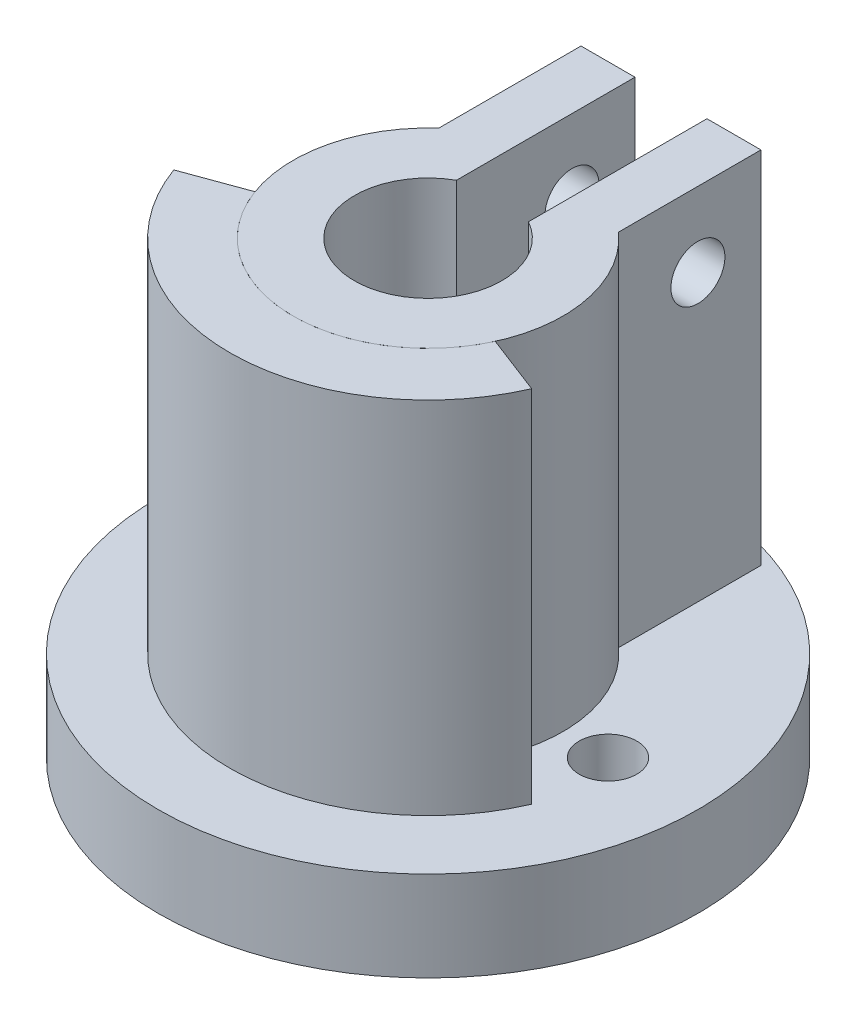
ISO-10303-21;
HEADER;
FILE_DESCRIPTION(('STEP AP214'),'2;1');
FILE_NAME('part.step','',(''),(''),'','','');
FILE_SCHEMA(('AUTOMOTIVE_DESIGN { 1 0 10303 214 1 1 1 1 }'));
ENDSEC;
DATA;
#1=APPLICATION_CONTEXT('core data for automotive mechanical design processes');
#2=APPLICATION_PROTOCOL_DEFINITION('international standard','automotive_design',2000,#1);
#3=PRODUCT_CONTEXT('',#1,'mechanical');
#4=PRODUCT('Part','Part','',(#3));
#5=PRODUCT_RELATED_PRODUCT_CATEGORY('part','',(#4));
#6=PRODUCT_DEFINITION_FORMATION('','',#4);
#7=PRODUCT_DEFINITION_CONTEXT('part definition',#1,'design');
#8=PRODUCT_DEFINITION('design','',#6,#7);
#9=PRODUCT_DEFINITION_SHAPE('','',#8);
#10=(LENGTH_UNIT() NAMED_UNIT(*) SI_UNIT(.MILLI.,.METRE.));
#11=(NAMED_UNIT(*) PLANE_ANGLE_UNIT() SI_UNIT($,.RADIAN.));
#12=(NAMED_UNIT(*) SI_UNIT($,.STERADIAN.) SOLID_ANGLE_UNIT());
#13=UNCERTAINTY_MEASURE_WITH_UNIT(LENGTH_MEASURE(1.E-05),#10,'distance_accuracy_value','');
#14=(GEOMETRIC_REPRESENTATION_CONTEXT(3) GLOBAL_UNCERTAINTY_ASSIGNED_CONTEXT((#13)) GLOBAL_UNIT_ASSIGNED_CONTEXT((#10,
#11,#12)) REPRESENTATION_CONTEXT('',''));
#15=CARTESIAN_POINT('',(0.,0.,0.));
#16=DIRECTION('',(0.,0.,1.));
#17=DIRECTION('',(1.,0.,0.));
#18=AXIS2_PLACEMENT_3D('',#15,#16,#17);
#19=CARTESIAN_POINT('',(0.,5.,0.));
#20=DIRECTION('',(-0.342845492340402,0.,-0.939391807704255));
#21=DIRECTION('',(-0.939391807704255,0.,0.342845492340402));
#22=AXIS2_PLACEMENT_3D('',#19,#20,#21);
#23=PLANE('',#22);
#24=DIRECTION('',(-0.939391807704255,0.,0.342845492340402));
#25=VECTOR('',#24,1.);
#26=CARTESIAN_POINT('',(0.,25.,0.));
#27=LINE('',#26,#25);
#28=CARTESIAN_POINT('',(-7.04543855778191,25.,2.57134119255302));
#29=VERTEX_POINT('',#28);
#30=CARTESIAN_POINT('',(-10.3531128788662,25.,3.77852782310841));
#31=VERTEX_POINT('',#30);
#32=EDGE_CURVE('E114',#29,#31,#27,.T.);
#33=ORIENTED_EDGE('',*,*,#32,.F.);
#34=DIRECTION('',(0.,1.,0.));
#35=VECTOR('',#34,1.);
#36=CARTESIAN_POINT('',(-7.04543855778191,5.,2.57134119255302));
#37=LINE('',#36,#35);
#38=CARTESIAN_POINT('',(-7.04543855778191,5.,2.57134119255302));
#39=VERTEX_POINT('',#38);
#40=EDGE_CURVE('E13',#39,#29,#37,.T.);
#41=ORIENTED_EDGE('',*,*,#40,.F.);
#42=DIRECTION('',(-0.939391807704255,0.,0.342845492340402));
#43=VECTOR('',#42,1.);
#44=CARTESIAN_POINT('',(0.,5.,0.));
#45=LINE('',#44,#43);
#46=CARTESIAN_POINT('',(-10.3531128788662,5.,3.77852782310841));
#47=VERTEX_POINT('',#46);
#48=EDGE_CURVE('E109',#39,#47,#45,.T.);
#49=ORIENTED_EDGE('',*,*,#48,.T.);
#50=DIRECTION('',(0.,1.,0.));
#51=VECTOR('',#50,1.);
#52=CARTESIAN_POINT('',(-10.3531128788662,5.,3.77852782310841));
#53=LINE('',#52,#51);
#54=EDGE_CURVE('E52',#47,#31,#53,.T.);
#55=ORIENTED_EDGE('',*,*,#54,.T.);
#56=EDGE_LOOP('',(#33,#41,#49,#55));
#57=FACE_BOUND('',#56,.T.);
#58=ADVANCED_FACE('F49',(#57),#23,.T.);
#59=CARTESIAN_POINT('',(0.,5.,0.));
#60=DIRECTION('',(0.,1.,0.));
#61=DIRECTION('',(0.,0.,1.));
#62=AXIS2_PLACEMENT_3D('',#59,#60,#61);
#63=CYLINDRICAL_SURFACE('',#62,7.5);
#64=CARTESIAN_POINT('',(0.,25.,0.));
#65=DIRECTION('',(0.,1.,0.));
#66=DIRECTION('',(0.,0.,1.));
#67=AXIS2_PLACEMENT_3D('',#64,#65,#66);
#68=CIRCLE('',#67,7.5);
#69=CARTESIAN_POINT('',(6.83078698314933,25.,3.09682889272844));
#70=VERTEX_POINT('',#69);
#71=EDGE_CURVE('E82',#29,#70,#68,.T.);
#72=ORIENTED_EDGE('',*,*,#71,.T.);
#73=DIRECTION('',(0.,1.,0.));
#74=VECTOR('',#73,1.);
#75=CARTESIAN_POINT('',(6.83078698314933,5.,3.09682889272844));
#76=LINE('',#75,#74);
#77=CARTESIAN_POINT('',(6.83078698314933,5.,3.09682889272844));
#78=VERTEX_POINT('',#77);
#79=EDGE_CURVE('E58',#78,#70,#76,.T.);
#80=ORIENTED_EDGE('',*,*,#79,.F.);
#81=CARTESIAN_POINT('',(0.,5.,0.));
#82=DIRECTION('',(0.,1.,0.));
#83=DIRECTION('',(0.,0.,1.));
#84=AXIS2_PLACEMENT_3D('',#81,#82,#83);
#85=CIRCLE('',#84,7.5);
#86=EDGE_CURVE('E99',#39,#78,#85,.T.);
#87=ORIENTED_EDGE('',*,*,#86,.F.);
#88=ORIENTED_EDGE('',*,*,#40,.T.);
#89=EDGE_LOOP('',(#72,#80,#87,#88));
#90=FACE_BOUND('',#89,.T.);
#91=ADVANCED_FACE('F124',(#90),#63,.F.);
#92=CARTESIAN_POINT('',(-0.15638143559644,5.,0.406081802327536));
#93=DIRECTION('',(-0.359371675329784,0.,0.933194512934289));
#94=DIRECTION('',(0.933194512934289,0.,0.359371675329784));
#95=AXIS2_PLACEMENT_3D('',#92,#93,#94);
#96=PLANE('',#95);
#97=DIRECTION('',(0.933194512934289,0.,0.359371675329784));
#98=VECTOR('',#97,1.);
#99=CARTESIAN_POINT('',(-0.15638143559644,25.,0.406081802327536));
#100=LINE('',#99,#98);
#101=CARTESIAN_POINT('',(10.1204106372597,25.,4.36365756284664));
#102=VERTEX_POINT('',#101);
#103=EDGE_CURVE('E106',#70,#102,#100,.T.);
#104=ORIENTED_EDGE('',*,*,#103,.T.);
#105=DIRECTION('',(0.,1.,0.));
#106=VECTOR('',#105,1.);
#107=CARTESIAN_POINT('',(10.1204106372597,5.,4.36365756284664));
#108=LINE('',#107,#106);
#109=CARTESIAN_POINT('',(10.1204106372597,5.,4.36365756284664));
#110=VERTEX_POINT('',#109);
#111=EDGE_CURVE('E103',#110,#102,#108,.T.);
#112=ORIENTED_EDGE('',*,*,#111,.F.);
#113=DIRECTION('',(0.933194512934289,0.,0.359371675329784));
#114=VECTOR('',#113,1.);
#115=CARTESIAN_POINT('',(-0.15638143559644,5.,0.406081802327536));
#116=LINE('',#115,#114);
#117=EDGE_CURVE('E94',#78,#110,#116,.T.);
#118=ORIENTED_EDGE('',*,*,#117,.F.);
#119=ORIENTED_EDGE('',*,*,#79,.T.);
#120=EDGE_LOOP('',(#104,#112,#118,#119));
#121=FACE_BOUND('',#120,.T.);
#122=ADVANCED_FACE('F104',(#121),#96,.F.);
#123=CARTESIAN_POINT('',(0.,5.,0.));
#124=DIRECTION('',(0.,1.,0.));
#125=DIRECTION('',(0.,0.,1.));
#126=AXIS2_PLACEMENT_3D('',#123,#124,#125);
#127=CYLINDRICAL_SURFACE('',#126,11.0210806544798);
#128=CARTESIAN_POINT('',(0.,25.,0.));
#129=DIRECTION('',(0.,1.,0.));
#130=DIRECTION('',(0.,0.,1.));
#131=AXIS2_PLACEMENT_3D('',#128,#129,#130);
#132=CIRCLE('',#131,11.0210806544798);
#133=EDGE_CURVE('E117',#31,#102,#132,.T.);
#134=ORIENTED_EDGE('',*,*,#133,.F.);
#135=ORIENTED_EDGE('',*,*,#54,.F.);
#136=CARTESIAN_POINT('',(0.,5.,0.));
#137=DIRECTION('',(0.,1.,0.));
#138=DIRECTION('',(0.,0.,1.));
#139=AXIS2_PLACEMENT_3D('',#136,#137,#138);
#140=CIRCLE('',#139,11.0210806544798);
#141=EDGE_CURVE('E98',#47,#110,#140,.T.);
#142=ORIENTED_EDGE('',*,*,#141,.T.);
#143=ORIENTED_EDGE('',*,*,#111,.T.);
#144=EDGE_LOOP('',(#134,#135,#142,#143));
#145=FACE_BOUND('',#144,.T.);
#146=ADVANCED_FACE('F108',(#145),#127,.T.);
#147=CARTESIAN_POINT('',(0.,5.,0.));
#148=DIRECTION('',(0.,1.,0.));
#149=DIRECTION('',(0.,0.,1.));
#150=AXIS2_PLACEMENT_3D('',#147,#148,#149);
#151=PLANE('',#150);
#152=ORIENTED_EDGE('',*,*,#48,.F.);
#153=ORIENTED_EDGE('',*,*,#86,.T.);
#154=ORIENTED_EDGE('',*,*,#117,.T.);
#155=ORIENTED_EDGE('',*,*,#141,.F.);
#156=EDGE_LOOP('',(#152,#153,#154,#155));
#157=FACE_BOUND('',#156,.T.);
#158=ADVANCED_FACE('F97',(#157),#151,.F.);
#159=CARTESIAN_POINT('',(0.,25.,0.));
#160=DIRECTION('',(0.,1.,0.));
#161=DIRECTION('',(0.,0.,1.));
#162=AXIS2_PLACEMENT_3D('',#159,#160,#161);
#163=PLANE('',#162);
#164=ORIENTED_EDGE('',*,*,#32,.T.);
#165=ORIENTED_EDGE('',*,*,#133,.T.);
#166=ORIENTED_EDGE('',*,*,#103,.F.);
#167=ORIENTED_EDGE('',*,*,#71,.F.);
#168=EDGE_LOOP('',(#164,#165,#166,#167));
#169=FACE_BOUND('',#168,.T.);
#170=ADVANCED_FACE('F122',(#169),#163,.T.);
#171=CLOSED_SHELL('',(#58,#91,#122,#146,#158,#170));
#172=MANIFOLD_SOLID_BREP('B2',#171);
#173=CARTESIAN_POINT('',(0.,5.,0.));
#174=DIRECTION('',(0.,1.,0.));
#175=DIRECTION('',(0.,0.,1.));
#176=AXIS2_PLACEMENT_3D('',#173,#174,#175);
#177=PLANE('',#176);
#178=CARTESIAN_POINT('',(0.,5.,0.));
#179=DIRECTION('',(0.,1.,0.));
#180=DIRECTION('',(0.,0.,1.));
#181=AXIS2_PLACEMENT_3D('',#178,#179,#180);
#182=CIRCLE('',#181,15.);
#183=CARTESIAN_POINT('',(0.,5.,15.));
#184=VERTEX_POINT('',#183);
#185=EDGE_CURVE('E332',#184,#184,#182,.T.);
#186=ORIENTED_EDGE('',*,*,#185,.T.);
#187=EDGE_LOOP('',(#186));
#188=FACE_BOUND('',#187,.T.);
#189=CARTESIAN_POINT('',(10.,5.,0.));
#190=DIRECTION('',(0.,1.,0.));
#191=DIRECTION('',(0.,0.,1.));
#192=AXIS2_PLACEMENT_3D('',#189,#190,#191);
#193=CIRCLE('',#192,1.6);
#194=CARTESIAN_POINT('',(10.,5.,1.6));
#195=VERTEX_POINT('',#194);
#196=EDGE_CURVE('E347',#195,#195,#193,.T.);
#197=ORIENTED_EDGE('',*,*,#196,.F.);
#198=EDGE_LOOP('',(#197));
#199=FACE_BOUND('',#198,.T.);
#200=CARTESIAN_POINT('',(-10.,5.,0.));
#201=DIRECTION('',(0.,1.,0.));
#202=DIRECTION('',(0.,0.,1.));
#203=AXIS2_PLACEMENT_3D('',#200,#201,#202);
#204=CIRCLE('',#203,1.6);
#205=CARTESIAN_POINT('',(-10.,5.,1.6));
#206=VERTEX_POINT('',#205);
#207=EDGE_CURVE('E344',#206,#206,#204,.T.);
#208=ORIENTED_EDGE('',*,*,#207,.F.);
#209=EDGE_LOOP('',(#208));
#210=FACE_BOUND('',#209,.T.);
#211=CARTESIAN_POINT('',(0.,5.,0.));
#212=DIRECTION('',(0.,1.,0.));
#213=DIRECTION('',(0.,0.,1.));
#214=AXIS2_PLACEMENT_3D('',#211,#212,#213);
#215=CIRCLE('',#214,7.5);
#216=CARTESIAN_POINT('',(-5.,5.,-5.59016994374947));
#217=VERTEX_POINT('',#216);
#218=CARTESIAN_POINT('',(5.,5.,-5.59016994374948));
#219=VERTEX_POINT('',#218);
#220=EDGE_CURVE('E339',#217,#219,#215,.T.);
#221=ORIENTED_EDGE('',*,*,#220,.F.);
#222=DIRECTION('',(0.,0.,-1.));
#223=VECTOR('',#222,1.);
#224=CARTESIAN_POINT('',(-5.,5.,0.));
#225=LINE('',#224,#223);
#226=CARTESIAN_POINT('',(-5.,5.,-13.5));
#227=VERTEX_POINT('',#226);
#228=EDGE_CURVE('E268',#217,#227,#225,.T.);
#229=ORIENTED_EDGE('',*,*,#228,.T.);
#230=DIRECTION('',(-1.,0.,0.));
#231=VECTOR('',#230,1.);
#232=CARTESIAN_POINT('',(0.,5.,-13.5));
#233=LINE('',#232,#231);
#234=CARTESIAN_POINT('',(-2.,5.,-13.5));
#235=VERTEX_POINT('',#234);
#236=EDGE_CURVE('E47',#235,#227,#233,.T.);
#237=ORIENTED_EDGE('',*,*,#236,.F.);
#238=DIRECTION('',(0.,0.,1.));
#239=VECTOR('',#238,1.);
#240=CARTESIAN_POINT('',(-2.,5.00000000000001,-20.));
#241=LINE('',#240,#239);
#242=CARTESIAN_POINT('',(-2.,5.00000000000001,-3.57910603363465));
#243=VERTEX_POINT('',#242);
#244=EDGE_CURVE('E265',#235,#243,#241,.T.);
#245=ORIENTED_EDGE('',*,*,#244,.T.);
#246=CARTESIAN_POINT('',(0.,5.,0.));
#247=DIRECTION('',(0.,1.,0.));
#248=DIRECTION('',(0.,0.,1.));
#249=AXIS2_PLACEMENT_3D('',#246,#247,#248);
#250=CIRCLE('',#249,4.1);
#251=CARTESIAN_POINT('',(2.,5.,-3.57910603363466));
#252=VERTEX_POINT('',#251);
#253=EDGE_CURVE('E323',#252,#243,#250,.T.);
#254=ORIENTED_EDGE('',*,*,#253,.F.);
#255=DIRECTION('',(0.,0.,1.));
#256=VECTOR('',#255,1.);
#257=CARTESIAN_POINT('',(2.,5.,-20.));
#258=LINE('',#257,#256);
#259=CARTESIAN_POINT('',(2.,5.,-13.5));
#260=VERTEX_POINT('',#259);
#261=EDGE_CURVE('E192',#260,#252,#258,.T.);
#262=ORIENTED_EDGE('',*,*,#261,.F.);
#263=DIRECTION('',(-1.,0.,0.));
#264=VECTOR('',#263,1.);
#265=CARTESIAN_POINT('',(0.,5.,-13.5));
#266=LINE('',#265,#264);
#267=CARTESIAN_POINT('',(5.,5.,-13.5));
#268=VERTEX_POINT('',#267);
#269=EDGE_CURVE('E196',#268,#260,#266,.T.);
#270=ORIENTED_EDGE('',*,*,#269,.F.);
#271=DIRECTION('',(0.,0.,-1.));
#272=VECTOR('',#271,1.);
#273=CARTESIAN_POINT('',(5.,5.,0.));
#274=LINE('',#273,#272);
#275=EDGE_CURVE('E300',#219,#268,#274,.T.);
#276=ORIENTED_EDGE('',*,*,#275,.F.);
#277=EDGE_LOOP('',(#221,#229,#237,#245,#254,#262,#270,#276));
#278=FACE_BOUND('',#277,.T.);
#279=ADVANCED_FACE('F176',(#188,#199,#210,#278),#177,.T.);
#280=CARTESIAN_POINT('',(0.,25.,0.));
#281=DIRECTION('',(0.,-1.,0.));
#282=DIRECTION('',(0.,0.,-1.));
#283=AXIS2_PLACEMENT_3D('',#280,#281,#282);
#284=CYLINDRICAL_SURFACE('',#283,7.5);
#285=DIRECTION('',(0.,-1.,0.));
#286=VECTOR('',#285,1.);
#287=CARTESIAN_POINT('',(-5.,25.,-5.59016994374947));
#288=LINE('',#287,#286);
#289=CARTESIAN_POINT('',(-5.,25.,-5.59016994374947));
#290=VERTEX_POINT('',#289);
#291=EDGE_CURVE('E185',#217,#290,#288,.F.);
#292=ORIENTED_EDGE('',*,*,#291,.F.);
#293=ORIENTED_EDGE('',*,*,#220,.T.);
#294=DIRECTION('',(0.,-1.,0.));
#295=VECTOR('',#294,1.);
#296=CARTESIAN_POINT('',(5.,25.,-5.59016994374948));
#297=LINE('',#296,#295);
#298=CARTESIAN_POINT('',(5.,25.,-5.59016994374948));
#299=VERTEX_POINT('',#298);
#300=EDGE_CURVE('E313',#219,#299,#297,.F.);
#301=ORIENTED_EDGE('',*,*,#300,.T.);
#302=CARTESIAN_POINT('',(0.,25.,0.));
#303=DIRECTION('',(0.,1.,0.));
#304=DIRECTION('',(0.,0.,1.));
#305=AXIS2_PLACEMENT_3D('',#302,#303,#304);
#306=CIRCLE('',#305,7.5);
#307=EDGE_CURVE('E336',#290,#299,#306,.T.);
#308=ORIENTED_EDGE('',*,*,#307,.F.);
#309=EDGE_LOOP('',(#292,#293,#301,#308));
#310=FACE_BOUND('',#309,.T.);
#311=ADVANCED_FACE('F375',(#310),#284,.T.);
#312=CARTESIAN_POINT('',(0.,5.,0.));
#313=DIRECTION('',(0.,-1.,0.));
#314=DIRECTION('',(0.,0.,-1.));
#315=AXIS2_PLACEMENT_3D('',#312,#313,#314);
#316=CYLINDRICAL_SURFACE('',#315,15.);
#317=ORIENTED_EDGE('',*,*,#185,.F.);
#318=EDGE_LOOP('',(#317));
#319=FACE_BOUND('',#318,.T.);
#320=CARTESIAN_POINT('',(0.,0.,0.));
#321=DIRECTION('',(0.,1.,0.));
#322=DIRECTION('',(0.,0.,1.));
#323=AXIS2_PLACEMENT_3D('',#320,#321,#322);
#324=CIRCLE('',#323,15.);
#325=CARTESIAN_POINT('',(0.,0.,15.));
#326=VERTEX_POINT('',#325);
#327=EDGE_CURVE('E333',#326,#326,#324,.T.);
#328=ORIENTED_EDGE('',*,*,#327,.T.);
#329=EDGE_LOOP('',(#328));
#330=FACE_BOUND('',#329,.T.);
#331=ADVANCED_FACE('F178',(#319,#330),#316,.T.);
#332=CARTESIAN_POINT('',(0.,0.,0.));
#333=DIRECTION('',(0.,1.,0.));
#334=DIRECTION('',(0.,0.,1.));
#335=AXIS2_PLACEMENT_3D('',#332,#333,#334);
#336=PLANE('',#335);
#337=CARTESIAN_POINT('',(0.,0.,0.));
#338=DIRECTION('',(0.,1.,0.));
#339=DIRECTION('',(0.,0.,1.));
#340=AXIS2_PLACEMENT_3D('',#337,#338,#339);
#341=CIRCLE('',#340,4.1);
#342=CARTESIAN_POINT('',(0.,0.,4.1));
#343=VERTEX_POINT('',#342);
#344=EDGE_CURVE('E326',#343,#343,#341,.T.);
#345=ORIENTED_EDGE('',*,*,#344,.T.);
#346=EDGE_LOOP('',(#345));
#347=FACE_BOUND('',#346,.T.);
#348=CARTESIAN_POINT('',(10.,0.,0.));
#349=DIRECTION('',(0.,1.,0.));
#350=DIRECTION('',(0.,0.,1.));
#351=AXIS2_PLACEMENT_3D('',#348,#349,#350);
#352=CIRCLE('',#351,1.6);
#353=CARTESIAN_POINT('',(10.,0.,1.6));
#354=VERTEX_POINT('',#353);
#355=EDGE_CURVE('E350',#354,#354,#352,.T.);
#356=ORIENTED_EDGE('',*,*,#355,.T.);
#357=EDGE_LOOP('',(#356));
#358=FACE_BOUND('',#357,.T.);
#359=CARTESIAN_POINT('',(-10.,0.,0.));
#360=DIRECTION('',(0.,1.,0.));
#361=DIRECTION('',(0.,0.,1.));
#362=AXIS2_PLACEMENT_3D('',#359,#360,#361);
#363=CIRCLE('',#362,1.6);
#364=CARTESIAN_POINT('',(-10.,0.,1.6));
#365=VERTEX_POINT('',#364);
#366=EDGE_CURVE('E343',#365,#365,#363,.T.);
#367=ORIENTED_EDGE('',*,*,#366,.T.);
#368=EDGE_LOOP('',(#367));
#369=FACE_BOUND('',#368,.T.);
#370=ORIENTED_EDGE('',*,*,#327,.F.);
#371=EDGE_LOOP('',(#370));
#372=FACE_BOUND('',#371,.T.);
#373=ADVANCED_FACE('F357',(#347,#358,#369,#372),#336,.F.);
#374=CARTESIAN_POINT('',(0.,25.,0.));
#375=DIRECTION('',(0.,1.,0.));
#376=DIRECTION('',(0.,0.,1.));
#377=AXIS2_PLACEMENT_3D('',#374,#375,#376);
#378=PLANE('',#377);
#379=DIRECTION('',(0.,0.,-1.));
#380=VECTOR('',#379,1.);
#381=CARTESIAN_POINT('',(-2.,25.,0.));
#382=LINE('',#381,#380);
#383=CARTESIAN_POINT('',(-2.,25.,-3.57910603363465));
#384=VERTEX_POINT('',#383);
#385=CARTESIAN_POINT('',(-2.,25.,-13.5));
#386=VERTEX_POINT('',#385);
#387=EDGE_CURVE('E240',#384,#386,#382,.T.);
#388=ORIENTED_EDGE('',*,*,#387,.T.);
#389=DIRECTION('',(1.,0.,0.));
#390=VECTOR('',#389,1.);
#391=CARTESIAN_POINT('',(-2.,25.,-13.5));
#392=LINE('',#391,#390);
#393=CARTESIAN_POINT('',(-5.,25.,-13.5));
#394=VERTEX_POINT('',#393);
#395=EDGE_CURVE('E244',#394,#386,#392,.T.);
#396=ORIENTED_EDGE('',*,*,#395,.F.);
#397=DIRECTION('',(0.,0.,1.));
#398=VECTOR('',#397,1.);
#399=CARTESIAN_POINT('',(-5.,25.,-8.5));
#400=LINE('',#399,#398);
#401=EDGE_CURVE('E266',#394,#290,#400,.T.);
#402=ORIENTED_EDGE('',*,*,#401,.T.);
#403=ORIENTED_EDGE('',*,*,#307,.T.);
#404=DIRECTION('',(0.,0.,1.));
#405=VECTOR('',#404,1.);
#406=CARTESIAN_POINT('',(5.,25.,-8.5));
#407=LINE('',#406,#405);
#408=CARTESIAN_POINT('',(5.,25.,-13.5));
#409=VERTEX_POINT('',#408);
#410=EDGE_CURVE('E291',#409,#299,#407,.T.);
#411=ORIENTED_EDGE('',*,*,#410,.F.);
#412=DIRECTION('',(-1.,0.,0.));
#413=VECTOR('',#412,1.);
#414=CARTESIAN_POINT('',(2.,25.,-13.5));
#415=LINE('',#414,#413);
#416=CARTESIAN_POINT('',(2.,25.,-13.5));
#417=VERTEX_POINT('',#416);
#418=EDGE_CURVE('E282',#409,#417,#415,.T.);
#419=ORIENTED_EDGE('',*,*,#418,.T.);
#420=DIRECTION('',(0.,0.,-1.));
#421=VECTOR('',#420,1.);
#422=CARTESIAN_POINT('',(2.,25.,0.));
#423=LINE('',#422,#421);
#424=CARTESIAN_POINT('',(2.,25.,-3.57910603363466));
#425=VERTEX_POINT('',#424);
#426=EDGE_CURVE('E252',#425,#417,#423,.T.);
#427=ORIENTED_EDGE('',*,*,#426,.F.);
#428=CARTESIAN_POINT('',(0.,25.,0.));
#429=DIRECTION('',(0.,1.,0.));
#430=DIRECTION('',(0.,0.,1.));
#431=AXIS2_PLACEMENT_3D('',#428,#429,#430);
#432=CIRCLE('',#431,4.1);
#433=EDGE_CURVE('E247',#384,#425,#432,.T.);
#434=ORIENTED_EDGE('',*,*,#433,.F.);
#435=EDGE_LOOP('',(#388,#396,#402,#403,#411,#419,#427,#434));
#436=FACE_BOUND('',#435,.T.);
#437=ADVANCED_FACE('F242',(#436),#378,.T.);
#438=CARTESIAN_POINT('',(0.,25.,0.));
#439=DIRECTION('',(0.,-1.,0.));
#440=DIRECTION('',(0.,0.,-1.));
#441=AXIS2_PLACEMENT_3D('',#438,#439,#440);
#442=CYLINDRICAL_SURFACE('',#441,4.1);
#443=DIRECTION('',(0.,-1.,0.));
#444=VECTOR('',#443,1.);
#445=CARTESIAN_POINT('',(2.,25.,-3.57910603363466));
#446=LINE('',#445,#444);
#447=EDGE_CURVE('E318',#252,#425,#446,.F.);
#448=ORIENTED_EDGE('',*,*,#447,.F.);
#449=ORIENTED_EDGE('',*,*,#253,.T.);
#450=DIRECTION('',(0.,-1.,0.));
#451=VECTOR('',#450,1.);
#452=CARTESIAN_POINT('',(-2.,25.,-3.57910603363465));
#453=LINE('',#452,#451);
#454=EDGE_CURVE('E330',#243,#384,#453,.F.);
#455=ORIENTED_EDGE('',*,*,#454,.T.);
#456=ORIENTED_EDGE('',*,*,#433,.T.);
#457=EDGE_LOOP('',(#448,#449,#455,#456));
#458=FACE_BOUND('',#457,.T.);
#459=ORIENTED_EDGE('',*,*,#344,.F.);
#460=EDGE_LOOP('',(#459));
#461=FACE_BOUND('',#460,.T.);
#462=ADVANCED_FACE('F360',(#458,#461),#442,.F.);
#463=CARTESIAN_POINT('',(-10.,0.,0.));
#464=DIRECTION('',(0.,1.,0.));
#465=DIRECTION('',(0.,0.,1.));
#466=AXIS2_PLACEMENT_3D('',#463,#464,#465);
#467=CYLINDRICAL_SURFACE('',#466,1.6);
#468=ORIENTED_EDGE('',*,*,#366,.F.);
#469=EDGE_LOOP('',(#468));
#470=FACE_BOUND('',#469,.T.);
#471=ORIENTED_EDGE('',*,*,#207,.T.);
#472=EDGE_LOOP('',(#471));
#473=FACE_BOUND('',#472,.T.);
#474=ADVANCED_FACE('F362',(#470,#473),#467,.F.);
#475=CARTESIAN_POINT('',(10.,0.,0.));
#476=DIRECTION('',(0.,1.,0.));
#477=DIRECTION('',(0.,0.,1.));
#478=AXIS2_PLACEMENT_3D('',#475,#476,#477);
#479=CYLINDRICAL_SURFACE('',#478,1.6);
#480=ORIENTED_EDGE('',*,*,#355,.F.);
#481=EDGE_LOOP('',(#480));
#482=FACE_BOUND('',#481,.T.);
#483=ORIENTED_EDGE('',*,*,#196,.T.);
#484=EDGE_LOOP('',(#483));
#485=FACE_BOUND('',#484,.T.);
#486=ADVANCED_FACE('F369',(#482,#485),#479,.F.);
#487=CARTESIAN_POINT('',(2.,0.,-20.));
#488=DIRECTION('',(1.,0.,0.));
#489=DIRECTION('',(0.,1.,0.));
#490=AXIS2_PLACEMENT_3D('',#487,#488,#489);
#491=PLANE('',#490);
#492=CARTESIAN_POINT('',(2.,20.8523885326031,-9.99671661476498));
#493=DIRECTION('',(1.,0.,0.));
#494=DIRECTION('',(0.,1.,0.));
#495=AXIS2_PLACEMENT_3D('',#492,#493,#494);
#496=CIRCLE('',#495,1.5);
#497=CARTESIAN_POINT('',(2.,22.3523885326031,-9.99671661476498));
#498=VERTEX_POINT('',#497);
#499=EDGE_CURVE('E262',#498,#498,#496,.T.);
#500=ORIENTED_EDGE('',*,*,#499,.T.);
#501=EDGE_LOOP('',(#500));
#502=FACE_BOUND('',#501,.T.);
#503=ORIENTED_EDGE('',*,*,#261,.T.);
#504=ORIENTED_EDGE('',*,*,#447,.T.);
#505=ORIENTED_EDGE('',*,*,#426,.T.);
#506=DIRECTION('',(0.,-1.,0.));
#507=VECTOR('',#506,1.);
#508=CARTESIAN_POINT('',(2.,25.,-13.5));
#509=LINE('',#508,#507);
#510=EDGE_CURVE('E288',#417,#260,#509,.T.);
#511=ORIENTED_EDGE('',*,*,#510,.T.);
#512=EDGE_LOOP('',(#503,#504,#505,#511));
#513=FACE_BOUND('',#512,.T.);
#514=ADVANCED_FACE('F441',(#502,#513),#491,.F.);
#515=CARTESIAN_POINT('',(-2.,0.,-20.));
#516=DIRECTION('',(1.,0.,0.));
#517=DIRECTION('',(0.,1.,0.));
#518=AXIS2_PLACEMENT_3D('',#515,#516,#517);
#519=PLANE('',#518);
#520=CARTESIAN_POINT('',(-2.,20.8523885326031,-9.99671661476498));
#521=DIRECTION('',(1.,0.,0.));
#522=DIRECTION('',(0.,1.,0.));
#523=AXIS2_PLACEMENT_3D('',#520,#521,#522);
#524=CIRCLE('',#523,1.5);
#525=CARTESIAN_POINT('',(-2.,22.3523885326031,-9.99671661476498));
#526=VERTEX_POINT('',#525);
#527=EDGE_CURVE('E555',#526,#526,#524,.T.);
#528=ORIENTED_EDGE('',*,*,#527,.F.);
#529=EDGE_LOOP('',(#528));
#530=FACE_BOUND('',#529,.T.);
#531=DIRECTION('',(0.,-1.,0.));
#532=VECTOR('',#531,1.);
#533=CARTESIAN_POINT('',(-2.,25.,-13.5));
#534=LINE('',#533,#532);
#535=EDGE_CURVE('E257',#386,#235,#534,.T.);
#536=ORIENTED_EDGE('',*,*,#535,.F.);
#537=ORIENTED_EDGE('',*,*,#387,.F.);
#538=ORIENTED_EDGE('',*,*,#454,.F.);
#539=ORIENTED_EDGE('',*,*,#244,.F.);
#540=EDGE_LOOP('',(#536,#537,#538,#539));
#541=FACE_BOUND('',#540,.T.);
#542=ADVANCED_FACE('F264',(#530,#541),#519,.T.);
#543=CARTESIAN_POINT('',(5.,25.,-8.5));
#544=DIRECTION('',(1.,0.,0.));
#545=DIRECTION('',(0.,0.,-1.));
#546=AXIS2_PLACEMENT_3D('',#543,#544,#545);
#547=PLANE('',#546);
#548=CARTESIAN_POINT('',(5.,20.8523885326031,-9.99671661476498));
#549=DIRECTION('',(1.,0.,0.));
#550=DIRECTION('',(0.,0.,-1.));
#551=AXIS2_PLACEMENT_3D('',#548,#549,#550);
#552=CIRCLE('',#551,1.5);
#553=CARTESIAN_POINT('',(5.,20.8523885326031,-11.496716614765));
#554=VERTEX_POINT('',#553);
#555=EDGE_CURVE('E552',#554,#554,#552,.T.);
#556=ORIENTED_EDGE('',*,*,#555,.F.);
#557=EDGE_LOOP('',(#556));
#558=FACE_BOUND('',#557,.T.);
#559=ORIENTED_EDGE('',*,*,#300,.F.);
#560=ORIENTED_EDGE('',*,*,#275,.T.);
#561=DIRECTION('',(0.,1.,0.));
#562=VECTOR('',#561,1.);
#563=CARTESIAN_POINT('',(5.,25.,-13.5));
#564=LINE('',#563,#562);
#565=EDGE_CURVE('E285',#268,#409,#564,.T.);
#566=ORIENTED_EDGE('',*,*,#565,.T.);
#567=ORIENTED_EDGE('',*,*,#410,.T.);
#568=EDGE_LOOP('',(#559,#560,#566,#567));
#569=FACE_BOUND('',#568,.T.);
#570=ADVANCED_FACE('F421',(#558,#569),#547,.T.);
#571=CARTESIAN_POINT('',(0.,0.,-13.5));
#572=DIRECTION('',(0.,0.,-1.));
#573=DIRECTION('',(-1.,0.,0.));
#574=AXIS2_PLACEMENT_3D('',#571,#572,#573);
#575=PLANE('',#574);
#576=ORIENTED_EDGE('',*,*,#565,.F.);
#577=ORIENTED_EDGE('',*,*,#269,.T.);
#578=ORIENTED_EDGE('',*,*,#510,.F.);
#579=ORIENTED_EDGE('',*,*,#418,.F.);
#580=EDGE_LOOP('',(#576,#577,#578,#579));
#581=FACE_BOUND('',#580,.T.);
#582=ADVANCED_FACE('F415',(#581),#575,.T.);
#583=CARTESIAN_POINT('',(-5.,25.,-8.5));
#584=DIRECTION('',(1.,0.,0.));
#585=DIRECTION('',(0.,0.,-1.));
#586=AXIS2_PLACEMENT_3D('',#583,#584,#585);
#587=PLANE('',#586);
#588=CARTESIAN_POINT('',(-5.,20.8523885326031,-9.99671661476498));
#589=DIRECTION('',(1.,0.,0.));
#590=DIRECTION('',(0.,0.,-1.));
#591=AXIS2_PLACEMENT_3D('',#588,#589,#590);
#592=CIRCLE('',#591,1.5);
#593=CARTESIAN_POINT('',(-5.,20.8523885326031,-11.496716614765));
#594=VERTEX_POINT('',#593);
#595=EDGE_CURVE('E180',#594,#594,#592,.T.);
#596=ORIENTED_EDGE('',*,*,#595,.T.);
#597=EDGE_LOOP('',(#596));
#598=FACE_BOUND('',#597,.T.);
#599=ORIENTED_EDGE('',*,*,#228,.F.);
#600=ORIENTED_EDGE('',*,*,#291,.T.);
#601=ORIENTED_EDGE('',*,*,#401,.F.);
#602=DIRECTION('',(0.,1.,0.));
#603=VECTOR('',#602,1.);
#604=CARTESIAN_POINT('',(-5.,25.,-13.5));
#605=LINE('',#604,#603);
#606=EDGE_CURVE('E260',#227,#394,#605,.T.);
#607=ORIENTED_EDGE('',*,*,#606,.F.);
#608=EDGE_LOOP('',(#599,#600,#601,#607));
#609=FACE_BOUND('',#608,.T.);
#610=ADVANCED_FACE('F420',(#598,#609),#587,.F.);
#611=CARTESIAN_POINT('',(0.,0.,-13.5));
#612=DIRECTION('',(0.,0.,-1.));
#613=DIRECTION('',(-1.,0.,0.));
#614=AXIS2_PLACEMENT_3D('',#611,#612,#613);
#615=PLANE('',#614);
#616=ORIENTED_EDGE('',*,*,#535,.T.);
#617=ORIENTED_EDGE('',*,*,#236,.T.);
#618=ORIENTED_EDGE('',*,*,#606,.T.);
#619=ORIENTED_EDGE('',*,*,#395,.T.);
#620=EDGE_LOOP('',(#616,#617,#618,#619));
#621=FACE_BOUND('',#620,.T.);
#622=ADVANCED_FACE('F256',(#621),#615,.T.);
#623=CARTESIAN_POINT('',(-15.,20.8523885326031,-9.99671661476498));
#624=DIRECTION('',(1.,0.,0.));
#625=DIRECTION('',(0.,0.,-1.));
#626=AXIS2_PLACEMENT_3D('',#623,#624,#625);
#627=CYLINDRICAL_SURFACE('',#626,1.5);
#628=ORIENTED_EDGE('',*,*,#527,.T.);
#629=EDGE_LOOP('',(#628));
#630=FACE_BOUND('',#629,.T.);
#631=ORIENTED_EDGE('',*,*,#595,.F.);
#632=EDGE_LOOP('',(#631));
#633=FACE_BOUND('',#632,.T.);
#634=ADVANCED_FACE('F434',(#630,#633),#627,.F.);
#635=ORIENTED_EDGE('',*,*,#555,.T.);
#636=EDGE_LOOP('',(#635));
#637=FACE_BOUND('',#636,.T.);
#638=ORIENTED_EDGE('',*,*,#499,.F.);
#639=EDGE_LOOP('',(#638));
#640=FACE_BOUND('',#639,.T.);
#641=ADVANCED_FACE('F477',(#637,#640),#627,.F.);
#642=CLOSED_SHELL('',(#279,#311,#331,#373,#437,#462,#474,#486,#514,#542,#570,#582,#610,#622,
#634,#641));
#643=MANIFOLD_SOLID_BREP('B7',#642);
#644=ADVANCED_BREP_SHAPE_REPRESENTATION('',(#18,#172,#643),#14);
#645=SHAPE_DEFINITION_REPRESENTATION(#9,#644);
ENDSEC;
END-ISO-10303-21;
